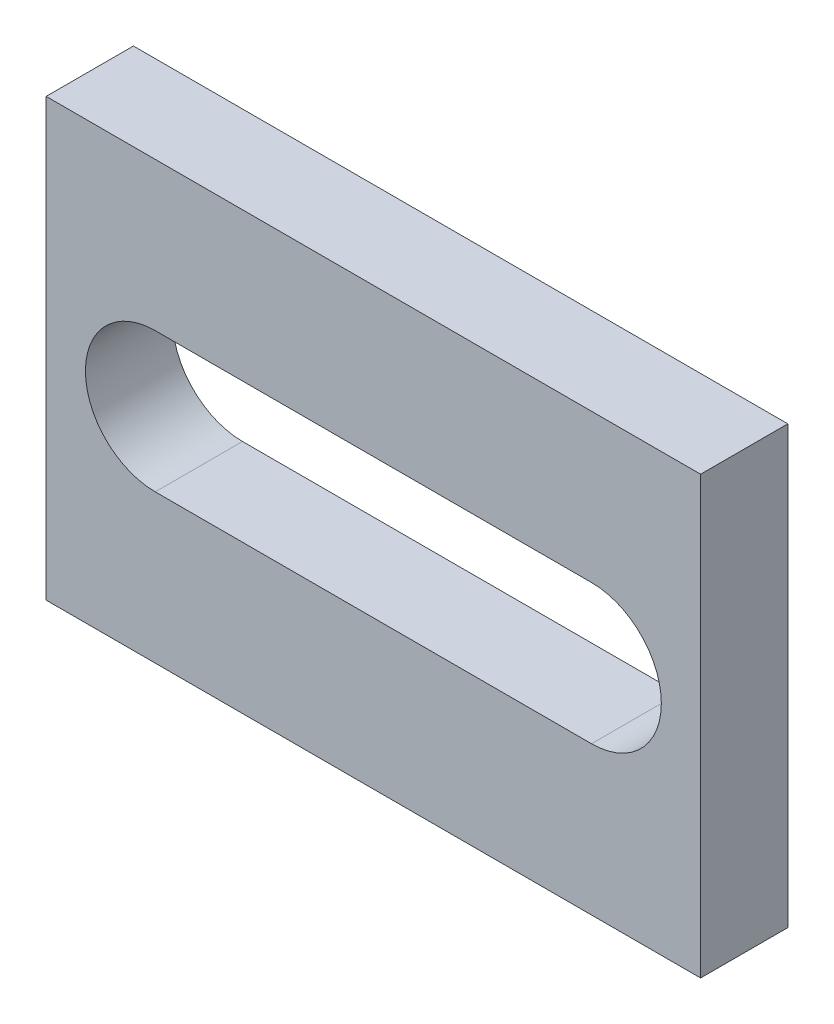
ISO-10303-21;
HEADER;
FILE_DESCRIPTION(('STEP AP214'),'2;1');
FILE_NAME('part.step','',(''),(''),'','','');
FILE_SCHEMA(('AUTOMOTIVE_DESIGN { 1 0 10303 214 1 1 1 1 }'));
ENDSEC;
DATA;
#1=APPLICATION_CONTEXT('core data for automotive mechanical design processes');
#2=APPLICATION_PROTOCOL_DEFINITION('international standard','automotive_design',2000,#1);
#3=PRODUCT_CONTEXT('',#1,'mechanical');
#4=PRODUCT('Part','Part','',(#3));
#5=PRODUCT_RELATED_PRODUCT_CATEGORY('part','',(#4));
#6=PRODUCT_DEFINITION_FORMATION('','',#4);
#7=PRODUCT_DEFINITION_CONTEXT('part definition',#1,'design');
#8=PRODUCT_DEFINITION('design','',#6,#7);
#9=PRODUCT_DEFINITION_SHAPE('','',#8);
#10=(LENGTH_UNIT() NAMED_UNIT(*) SI_UNIT(.MILLI.,.METRE.));
#11=(NAMED_UNIT(*) PLANE_ANGLE_UNIT() SI_UNIT($,.RADIAN.));
#12=(NAMED_UNIT(*) SI_UNIT($,.STERADIAN.) SOLID_ANGLE_UNIT());
#13=UNCERTAINTY_MEASURE_WITH_UNIT(LENGTH_MEASURE(1.E-05),#10,'distance_accuracy_value','');
#14=(GEOMETRIC_REPRESENTATION_CONTEXT(3) GLOBAL_UNCERTAINTY_ASSIGNED_CONTEXT((#13)) GLOBAL_UNIT_ASSIGNED_CONTEXT((#10,
#11,#12)) REPRESENTATION_CONTEXT('',''));
#15=CARTESIAN_POINT('',(0.,0.,0.));
#16=DIRECTION('',(0.,0.,1.));
#17=DIRECTION('',(1.,0.,0.));
#18=AXIS2_PLACEMENT_3D('',#15,#16,#17);
#19=CARTESIAN_POINT('',(0.,0.,10.));
#20=DIRECTION('',(0.,0.,-1.));
#21=DIRECTION('',(-1.,0.,0.));
#22=AXIS2_PLACEMENT_3D('',#19,#20,#21);
#23=PLANE('',#22);
#24=DIRECTION('',(0.,-1.,0.));
#25=VECTOR('',#24,1.);
#26=CARTESIAN_POINT('',(0.,0.,10.));
#27=LINE('',#26,#25);
#28=CARTESIAN_POINT('',(0.,50.,10.));
#29=VERTEX_POINT('',#28);
#30=CARTESIAN_POINT('',(0.,0.,10.));
#31=VERTEX_POINT('',#30);
#32=EDGE_CURVE('E134',#29,#31,#27,.T.);
#33=ORIENTED_EDGE('',*,*,#32,.T.);
#34=DIRECTION('',(1.,0.,0.));
#35=VECTOR('',#34,1.);
#36=CARTESIAN_POINT('',(0.,0.,10.));
#37=LINE('',#36,#35);
#38=CARTESIAN_POINT('',(75.,0.,10.));
#39=VERTEX_POINT('',#38);
#40=EDGE_CURVE('E137',#31,#39,#37,.T.);
#41=ORIENTED_EDGE('',*,*,#40,.T.);
#42=DIRECTION('',(0.,1.,0.));
#43=VECTOR('',#42,1.);
#44=CARTESIAN_POINT('',(75.,0.,10.));
#45=LINE('',#44,#43);
#46=CARTESIAN_POINT('',(75.,50.,10.));
#47=VERTEX_POINT('',#46);
#48=EDGE_CURVE('E140',#39,#47,#45,.T.);
#49=ORIENTED_EDGE('',*,*,#48,.T.);
#50=DIRECTION('',(-1.,0.,0.));
#51=VECTOR('',#50,1.);
#52=CARTESIAN_POINT('',(0.,50.,10.));
#53=LINE('',#52,#51);
#54=EDGE_CURVE('E142',#47,#29,#53,.T.);
#55=ORIENTED_EDGE('',*,*,#54,.T.);
#56=EDGE_LOOP('',(#33,#41,#49,#55));
#57=FACE_BOUND('',#56,.T.);
#58=CARTESIAN_POINT('',(62.5,25.,10.));
#59=DIRECTION('',(0.,0.,1.));
#60=DIRECTION('',(-1.,0.,0.));
#61=AXIS2_PLACEMENT_3D('',#58,#59,#60);
#62=CIRCLE('',#61,8.);
#63=CARTESIAN_POINT('',(62.5,17.,10.));
#64=VERTEX_POINT('',#63);
#65=CARTESIAN_POINT('',(62.5,33.,10.));
#66=VERTEX_POINT('',#65);
#67=EDGE_CURVE('E98',#64,#66,#62,.T.);
#68=ORIENTED_EDGE('',*,*,#67,.F.);
#69=DIRECTION('',(1.,0.,0.));
#70=VECTOR('',#69,1.);
#71=CARTESIAN_POINT('',(12.5,17.,10.));
#72=LINE('',#71,#70);
#73=CARTESIAN_POINT('',(12.5,17.,10.));
#74=VERTEX_POINT('',#73);
#75=EDGE_CURVE('E120',#74,#64,#72,.T.);
#76=ORIENTED_EDGE('',*,*,#75,.F.);
#77=CARTESIAN_POINT('',(12.5,25.,10.));
#78=DIRECTION('',(0.,0.,1.));
#79=DIRECTION('',(1.,0.,0.));
#80=AXIS2_PLACEMENT_3D('',#77,#78,#79);
#81=CIRCLE('',#80,8.);
#82=CARTESIAN_POINT('',(12.5,33.,10.));
#83=VERTEX_POINT('',#82);
#84=EDGE_CURVE('E118',#83,#74,#81,.T.);
#85=ORIENTED_EDGE('',*,*,#84,.F.);
#86=DIRECTION('',(-1.,0.,0.));
#87=VECTOR('',#86,1.);
#88=CARTESIAN_POINT('',(12.5,33.,10.));
#89=LINE('',#88,#87);
#90=EDGE_CURVE('E106',#66,#83,#89,.T.);
#91=ORIENTED_EDGE('',*,*,#90,.F.);
#92=EDGE_LOOP('',(#68,#76,#85,#91));
#93=FACE_BOUND('',#92,.T.);
#94=ADVANCED_FACE('F33',(#57,#93),#23,.F.);
#95=CARTESIAN_POINT('',(0.,0.,0.));
#96=DIRECTION('',(0.,0.,-1.));
#97=DIRECTION('',(-1.,0.,0.));
#98=AXIS2_PLACEMENT_3D('',#95,#96,#97);
#99=PLANE('',#98);
#100=DIRECTION('',(0.,-1.,0.));
#101=VECTOR('',#100,1.);
#102=CARTESIAN_POINT('',(0.,0.,0.));
#103=LINE('',#102,#101);
#104=CARTESIAN_POINT('',(0.,50.,0.));
#105=VERTEX_POINT('',#104);
#106=CARTESIAN_POINT('',(0.,0.,0.));
#107=VERTEX_POINT('',#106);
#108=EDGE_CURVE('E114',#105,#107,#103,.T.);
#109=ORIENTED_EDGE('',*,*,#108,.F.);
#110=DIRECTION('',(-1.,0.,0.));
#111=VECTOR('',#110,1.);
#112=CARTESIAN_POINT('',(0.,50.,0.));
#113=LINE('',#112,#111);
#114=CARTESIAN_POINT('',(75.,50.,0.));
#115=VERTEX_POINT('',#114);
#116=EDGE_CURVE('E138',#115,#105,#113,.T.);
#117=ORIENTED_EDGE('',*,*,#116,.F.);
#118=DIRECTION('',(0.,1.,0.));
#119=VECTOR('',#118,1.);
#120=CARTESIAN_POINT('',(75.,0.,0.));
#121=LINE('',#120,#119);
#122=CARTESIAN_POINT('',(75.,0.,0.));
#123=VERTEX_POINT('',#122);
#124=EDGE_CURVE('E149',#123,#115,#121,.T.);
#125=ORIENTED_EDGE('',*,*,#124,.F.);
#126=DIRECTION('',(1.,0.,0.));
#127=VECTOR('',#126,1.);
#128=CARTESIAN_POINT('',(0.,0.,0.));
#129=LINE('',#128,#127);
#130=EDGE_CURVE('E147',#107,#123,#129,.T.);
#131=ORIENTED_EDGE('',*,*,#130,.F.);
#132=EDGE_LOOP('',(#109,#117,#125,#131));
#133=FACE_BOUND('',#132,.T.);
#134=DIRECTION('',(1.,0.,0.));
#135=VECTOR('',#134,1.);
#136=CARTESIAN_POINT('',(12.5,17.,0.));
#137=LINE('',#136,#135);
#138=CARTESIAN_POINT('',(12.5,17.,0.));
#139=VERTEX_POINT('',#138);
#140=CARTESIAN_POINT('',(62.5,17.,0.));
#141=VERTEX_POINT('',#140);
#142=EDGE_CURVE('E107',#139,#141,#137,.T.);
#143=ORIENTED_EDGE('',*,*,#142,.T.);
#144=CARTESIAN_POINT('',(62.5,25.,0.));
#145=DIRECTION('',(0.,0.,1.));
#146=DIRECTION('',(-1.,0.,0.));
#147=AXIS2_PLACEMENT_3D('',#144,#145,#146);
#148=CIRCLE('',#147,8.);
#149=CARTESIAN_POINT('',(62.5,33.,0.));
#150=VERTEX_POINT('',#149);
#151=EDGE_CURVE('E56',#141,#150,#148,.T.);
#152=ORIENTED_EDGE('',*,*,#151,.T.);
#153=DIRECTION('',(-1.,0.,0.));
#154=VECTOR('',#153,1.);
#155=CARTESIAN_POINT('',(12.5,33.,0.));
#156=LINE('',#155,#154);
#157=CARTESIAN_POINT('',(12.5,33.,0.));
#158=VERTEX_POINT('',#157);
#159=EDGE_CURVE('E113',#150,#158,#156,.T.);
#160=ORIENTED_EDGE('',*,*,#159,.T.);
#161=CARTESIAN_POINT('',(12.5,25.,0.));
#162=DIRECTION('',(0.,0.,1.));
#163=DIRECTION('',(1.,0.,0.));
#164=AXIS2_PLACEMENT_3D('',#161,#162,#163);
#165=CIRCLE('',#164,8.);
#166=EDGE_CURVE('E126',#158,#139,#165,.T.);
#167=ORIENTED_EDGE('',*,*,#166,.T.);
#168=EDGE_LOOP('',(#143,#152,#160,#167));
#169=FACE_BOUND('',#168,.T.);
#170=ADVANCED_FACE('F167',(#133,#169),#99,.T.);
#171=CARTESIAN_POINT('',(0.,0.,10.));
#172=DIRECTION('',(1.,0.,0.));
#173=DIRECTION('',(0.,0.,-1.));
#174=AXIS2_PLACEMENT_3D('',#171,#172,#173);
#175=PLANE('',#174);
#176=ORIENTED_EDGE('',*,*,#108,.T.);
#177=DIRECTION('',(0.,0.,-1.));
#178=VECTOR('',#177,1.);
#179=CARTESIAN_POINT('',(0.,0.,10.));
#180=LINE('',#179,#178);
#181=EDGE_CURVE('E11',#31,#107,#180,.T.);
#182=ORIENTED_EDGE('',*,*,#181,.F.);
#183=ORIENTED_EDGE('',*,*,#32,.F.);
#184=DIRECTION('',(0.,0.,-1.));
#185=VECTOR('',#184,1.);
#186=CARTESIAN_POINT('',(0.,50.,10.));
#187=LINE('',#186,#185);
#188=EDGE_CURVE('E144',#29,#105,#187,.T.);
#189=ORIENTED_EDGE('',*,*,#188,.T.);
#190=EDGE_LOOP('',(#176,#182,#183,#189));
#191=FACE_BOUND('',#190,.T.);
#192=ADVANCED_FACE('F35',(#191),#175,.F.);
#193=CARTESIAN_POINT('',(0.,0.,10.));
#194=DIRECTION('',(0.,1.,0.));
#195=DIRECTION('',(0.,0.,1.));
#196=AXIS2_PLACEMENT_3D('',#193,#194,#195);
#197=PLANE('',#196);
#198=ORIENTED_EDGE('',*,*,#130,.T.);
#199=DIRECTION('',(0.,0.,-1.));
#200=VECTOR('',#199,1.);
#201=CARTESIAN_POINT('',(75.,0.,10.));
#202=LINE('',#201,#200);
#203=EDGE_CURVE('E41',#39,#123,#202,.T.);
#204=ORIENTED_EDGE('',*,*,#203,.F.);
#205=ORIENTED_EDGE('',*,*,#40,.F.);
#206=ORIENTED_EDGE('',*,*,#181,.T.);
#207=EDGE_LOOP('',(#198,#204,#205,#206));
#208=FACE_BOUND('',#207,.T.);
#209=ADVANCED_FACE('F177',(#208),#197,.F.);
#210=CARTESIAN_POINT('',(75.,0.,10.));
#211=DIRECTION('',(-1.,0.,0.));
#212=DIRECTION('',(0.,0.,1.));
#213=AXIS2_PLACEMENT_3D('',#210,#211,#212);
#214=PLANE('',#213);
#215=ORIENTED_EDGE('',*,*,#124,.T.);
#216=DIRECTION('',(0.,0.,-1.));
#217=VECTOR('',#216,1.);
#218=CARTESIAN_POINT('',(75.,50.,10.));
#219=LINE('',#218,#217);
#220=EDGE_CURVE('E154',#47,#115,#219,.T.);
#221=ORIENTED_EDGE('',*,*,#220,.F.);
#222=ORIENTED_EDGE('',*,*,#48,.F.);
#223=ORIENTED_EDGE('',*,*,#203,.T.);
#224=EDGE_LOOP('',(#215,#221,#222,#223));
#225=FACE_BOUND('',#224,.T.);
#226=ADVANCED_FACE('F161',(#225),#214,.F.);
#227=CARTESIAN_POINT('',(0.,50.,10.));
#228=DIRECTION('',(0.,-1.,0.));
#229=DIRECTION('',(0.,0.,-1.));
#230=AXIS2_PLACEMENT_3D('',#227,#228,#229);
#231=PLANE('',#230);
#232=ORIENTED_EDGE('',*,*,#116,.T.);
#233=ORIENTED_EDGE('',*,*,#188,.F.);
#234=ORIENTED_EDGE('',*,*,#54,.F.);
#235=ORIENTED_EDGE('',*,*,#220,.T.);
#236=EDGE_LOOP('',(#232,#233,#234,#235));
#237=FACE_BOUND('',#236,.T.);
#238=ADVANCED_FACE('F171',(#237),#231,.F.);
#239=CARTESIAN_POINT('',(62.5,25.,10.));
#240=DIRECTION('',(0.,0.,-1.));
#241=DIRECTION('',(-1.,0.,0.));
#242=AXIS2_PLACEMENT_3D('',#239,#240,#241);
#243=CYLINDRICAL_SURFACE('',#242,8.);
#244=ORIENTED_EDGE('',*,*,#151,.F.);
#245=DIRECTION('',(0.,0.,-1.));
#246=VECTOR('',#245,1.);
#247=CARTESIAN_POINT('',(62.5,17.,10.));
#248=LINE('',#247,#246);
#249=EDGE_CURVE('E102',#64,#141,#248,.T.);
#250=ORIENTED_EDGE('',*,*,#249,.F.);
#251=ORIENTED_EDGE('',*,*,#67,.T.);
#252=DIRECTION('',(0.,0.,-1.));
#253=VECTOR('',#252,1.);
#254=CARTESIAN_POINT('',(62.5,33.,10.));
#255=LINE('',#254,#253);
#256=EDGE_CURVE('E101',#66,#150,#255,.T.);
#257=ORIENTED_EDGE('',*,*,#256,.T.);
#258=EDGE_LOOP('',(#244,#250,#251,#257));
#259=FACE_BOUND('',#258,.T.);
#260=ADVANCED_FACE('F100',(#259),#243,.F.);
#261=CARTESIAN_POINT('',(12.5,33.,10.));
#262=DIRECTION('',(0.,-1.,0.));
#263=DIRECTION('',(0.,0.,-1.));
#264=AXIS2_PLACEMENT_3D('',#261,#262,#263);
#265=PLANE('',#264);
#266=ORIENTED_EDGE('',*,*,#159,.F.);
#267=ORIENTED_EDGE('',*,*,#256,.F.);
#268=ORIENTED_EDGE('',*,*,#90,.T.);
#269=DIRECTION('',(0.,0.,-1.));
#270=VECTOR('',#269,1.);
#271=CARTESIAN_POINT('',(12.5,33.,10.));
#272=LINE('',#271,#270);
#273=EDGE_CURVE('E115',#83,#158,#272,.T.);
#274=ORIENTED_EDGE('',*,*,#273,.T.);
#275=EDGE_LOOP('',(#266,#267,#268,#274));
#276=FACE_BOUND('',#275,.T.);
#277=ADVANCED_FACE('F110',(#276),#265,.T.);
#278=CARTESIAN_POINT('',(12.5,25.,10.));
#279=DIRECTION('',(0.,0.,-1.));
#280=DIRECTION('',(-1.,0.,0.));
#281=AXIS2_PLACEMENT_3D('',#278,#279,#280);
#282=CYLINDRICAL_SURFACE('',#281,8.);
#283=ORIENTED_EDGE('',*,*,#166,.F.);
#284=ORIENTED_EDGE('',*,*,#273,.F.);
#285=ORIENTED_EDGE('',*,*,#84,.T.);
#286=DIRECTION('',(0.,0.,-1.));
#287=VECTOR('',#286,1.);
#288=CARTESIAN_POINT('',(12.5,17.,10.));
#289=LINE('',#288,#287);
#290=EDGE_CURVE('E48',#74,#139,#289,.T.);
#291=ORIENTED_EDGE('',*,*,#290,.T.);
#292=EDGE_LOOP('',(#283,#284,#285,#291));
#293=FACE_BOUND('',#292,.T.);
#294=ADVANCED_FACE('F200',(#293),#282,.F.);
#295=CARTESIAN_POINT('',(12.5,17.,10.));
#296=DIRECTION('',(0.,1.,0.));
#297=DIRECTION('',(0.,0.,1.));
#298=AXIS2_PLACEMENT_3D('',#295,#296,#297);
#299=PLANE('',#298);
#300=ORIENTED_EDGE('',*,*,#142,.F.);
#301=ORIENTED_EDGE('',*,*,#290,.F.);
#302=ORIENTED_EDGE('',*,*,#75,.T.);
#303=ORIENTED_EDGE('',*,*,#249,.T.);
#304=EDGE_LOOP('',(#300,#301,#302,#303));
#305=FACE_BOUND('',#304,.T.);
#306=ADVANCED_FACE('F204',(#305),#299,.T.);
#307=CLOSED_SHELL('',(#94,#170,#192,#209,#226,#238,#260,#277,#294,#306));
#308=MANIFOLD_SOLID_BREP('B2',#307);
#309=ADVANCED_BREP_SHAPE_REPRESENTATION('',(#18,#308),#14);
#310=SHAPE_DEFINITION_REPRESENTATION(#9,#309);
ENDSEC;
END-ISO-10303-21;
